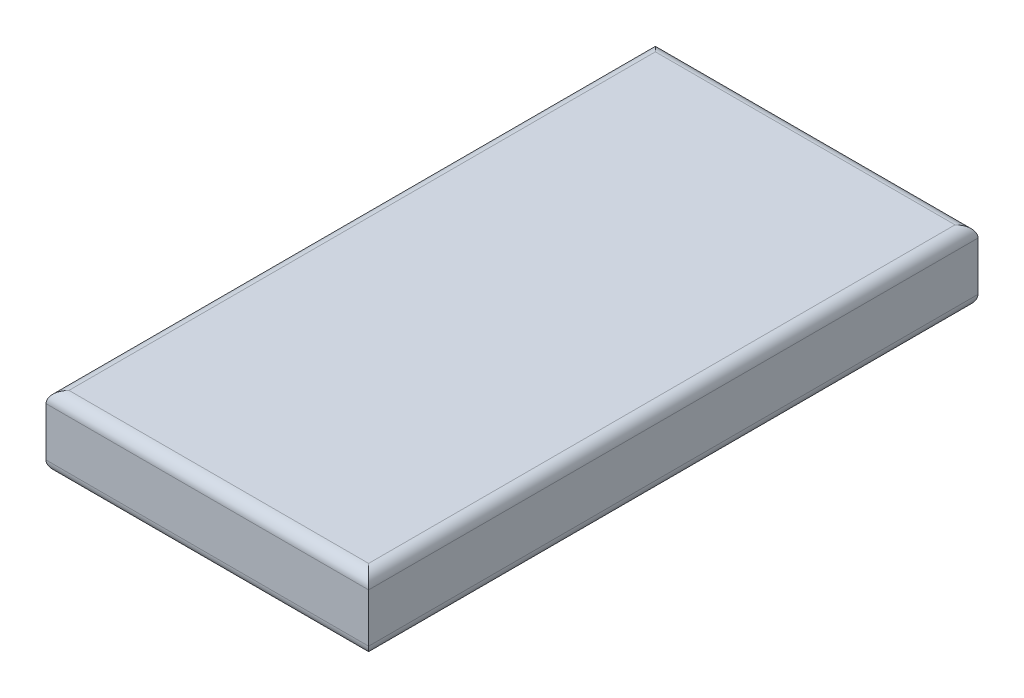
ISO-10303-21;
HEADER;
FILE_DESCRIPTION(('STEP AP214'),'2;1');
FILE_NAME('part.step','',(''),(''),'','','');
FILE_SCHEMA(('AUTOMOTIVE_DESIGN { 1 0 10303 214 1 1 1 1 }'));
ENDSEC;
DATA;
#1=APPLICATION_CONTEXT('core data for automotive mechanical design processes');
#2=APPLICATION_PROTOCOL_DEFINITION('international standard','automotive_design',2000,#1);
#3=PRODUCT_CONTEXT('',#1,'mechanical');
#4=PRODUCT('Part','Part','',(#3));
#5=PRODUCT_RELATED_PRODUCT_CATEGORY('part','',(#4));
#6=PRODUCT_DEFINITION_FORMATION('','',#4);
#7=PRODUCT_DEFINITION_CONTEXT('part definition',#1,'design');
#8=PRODUCT_DEFINITION('design','',#6,#7);
#9=PRODUCT_DEFINITION_SHAPE('','',#8);
#10=(LENGTH_UNIT() NAMED_UNIT(*) SI_UNIT(.MILLI.,.METRE.));
#11=(NAMED_UNIT(*) PLANE_ANGLE_UNIT() SI_UNIT($,.RADIAN.));
#12=(NAMED_UNIT(*) SI_UNIT($,.STERADIAN.) SOLID_ANGLE_UNIT());
#13=UNCERTAINTY_MEASURE_WITH_UNIT(LENGTH_MEASURE(1.E-05),#10,'distance_accuracy_value','');
#14=(GEOMETRIC_REPRESENTATION_CONTEXT(3) GLOBAL_UNCERTAINTY_ASSIGNED_CONTEXT((#13)) GLOBAL_UNIT_ASSIGNED_CONTEXT((#10,
#11,#12)) REPRESENTATION_CONTEXT('',''));
#15=CARTESIAN_POINT('',(0.,0.,0.));
#16=DIRECTION('',(0.,0.,1.));
#17=DIRECTION('',(1.,0.,0.));
#18=AXIS2_PLACEMENT_3D('',#15,#16,#17);
#19=CARTESIAN_POINT('',(0.,3.175,0.));
#20=DIRECTION('',(-1.,0.,0.));
#21=DIRECTION('',(0.,0.,1.));
#22=AXIS2_PLACEMENT_3D('',#19,#20,#21);
#23=PLANE('',#22);
#24=DIRECTION('',(0.,-1.,0.));
#25=VECTOR('',#24,1.);
#26=CARTESIAN_POINT('',(0.,3.175,0.));
#27=LINE('',#26,#25);
#28=CARTESIAN_POINT('',(0.,2.667,0.));
#29=VERTEX_POINT('',#28);
#30=CARTESIAN_POINT('',(0.,0.508,0.));
#31=VERTEX_POINT('',#30);
#32=EDGE_CURVE('E162',#29,#31,#27,.T.);
#33=ORIENTED_EDGE('',*,*,#32,.T.);
#34=DIRECTION('',(0.,0.,-1.));
#35=VECTOR('',#34,1.);
#36=CARTESIAN_POINT('',(0.,0.508,0.));
#37=LINE('',#36,#35);
#38=CARTESIAN_POINT('',(0.,0.508,-26.9875));
#39=VERTEX_POINT('',#38);
#40=EDGE_CURVE('E176',#31,#39,#37,.T.);
#41=ORIENTED_EDGE('',*,*,#40,.T.);
#42=DIRECTION('',(0.,-1.,0.));
#43=VECTOR('',#42,1.);
#44=CARTESIAN_POINT('',(0.,3.175,-26.9875));
#45=LINE('',#44,#43);
#46=CARTESIAN_POINT('',(0.,2.667,-26.9875));
#47=VERTEX_POINT('',#46);
#48=EDGE_CURVE('E133',#47,#39,#45,.T.);
#49=ORIENTED_EDGE('',*,*,#48,.F.);
#50=DIRECTION('',(0.,0.,-1.));
#51=VECTOR('',#50,1.);
#52=CARTESIAN_POINT('',(0.,2.667,0.));
#53=LINE('',#52,#51);
#54=EDGE_CURVE('E179',#47,#29,#53,.F.);
#55=ORIENTED_EDGE('',*,*,#54,.T.);
#56=EDGE_LOOP('',(#33,#41,#49,#55));
#57=FACE_BOUND('',#56,.T.);
#58=ADVANCED_FACE('F43',(#57),#23,.F.);
#59=CARTESIAN_POINT('',(0.,3.175,-26.9875));
#60=DIRECTION('',(0.,0.,1.));
#61=DIRECTION('',(1.,0.,0.));
#62=AXIS2_PLACEMENT_3D('',#59,#60,#61);
#63=PLANE('',#62);
#64=ORIENTED_EDGE('',*,*,#48,.T.);
#65=DIRECTION('',(-1.,0.,0.));
#66=VECTOR('',#65,1.);
#67=CARTESIAN_POINT('',(0.,0.508,-26.9875));
#68=LINE('',#67,#66);
#69=CARTESIAN_POINT('',(-14.2875,0.508,-26.9875));
#70=VERTEX_POINT('',#69);
#71=EDGE_CURVE('E131',#39,#70,#68,.T.);
#72=ORIENTED_EDGE('',*,*,#71,.T.);
#73=DIRECTION('',(0.,-1.,0.));
#74=VECTOR('',#73,1.);
#75=CARTESIAN_POINT('',(-14.2875,3.175,-26.9875));
#76=LINE('',#75,#74);
#77=CARTESIAN_POINT('',(-14.2875,2.667,-26.9875));
#78=VERTEX_POINT('',#77);
#79=EDGE_CURVE('E113',#78,#70,#76,.T.);
#80=ORIENTED_EDGE('',*,*,#79,.F.);
#81=DIRECTION('',(-1.,0.,0.));
#82=VECTOR('',#81,1.);
#83=CARTESIAN_POINT('',(0.,2.667,-26.9875));
#84=LINE('',#83,#82);
#85=EDGE_CURVE('E128',#78,#47,#84,.F.);
#86=ORIENTED_EDGE('',*,*,#85,.T.);
#87=EDGE_LOOP('',(#64,#72,#80,#86));
#88=FACE_BOUND('',#87,.T.);
#89=ADVANCED_FACE('F127',(#88),#63,.F.);
#90=CARTESIAN_POINT('',(-14.2875,3.175,0.));
#91=DIRECTION('',(1.,0.,0.));
#92=DIRECTION('',(0.,0.,-1.));
#93=AXIS2_PLACEMENT_3D('',#90,#91,#92);
#94=PLANE('',#93);
#95=ORIENTED_EDGE('',*,*,#79,.T.);
#96=DIRECTION('',(0.,0.,1.));
#97=VECTOR('',#96,1.);
#98=CARTESIAN_POINT('',(-14.2875,0.508,0.));
#99=LINE('',#98,#97);
#100=CARTESIAN_POINT('',(-14.2875,0.508,0.));
#101=VERTEX_POINT('',#100);
#102=EDGE_CURVE('E120',#70,#101,#99,.T.);
#103=ORIENTED_EDGE('',*,*,#102,.T.);
#104=DIRECTION('',(0.,-1.,0.));
#105=VECTOR('',#104,1.);
#106=CARTESIAN_POINT('',(-14.2875,3.175,0.));
#107=LINE('',#106,#105);
#108=CARTESIAN_POINT('',(-14.2875,2.667,0.));
#109=VERTEX_POINT('',#108);
#110=EDGE_CURVE('E115',#109,#101,#107,.T.);
#111=ORIENTED_EDGE('',*,*,#110,.F.);
#112=DIRECTION('',(0.,0.,1.));
#113=VECTOR('',#112,1.);
#114=CARTESIAN_POINT('',(-14.2875,2.667,-26.9875));
#115=LINE('',#114,#113);
#116=EDGE_CURVE('E110',#109,#78,#115,.F.);
#117=ORIENTED_EDGE('',*,*,#116,.T.);
#118=EDGE_LOOP('',(#95,#103,#111,#117));
#119=FACE_BOUND('',#118,.T.);
#120=ADVANCED_FACE('F112',(#119),#94,.F.);
#121=CARTESIAN_POINT('',(0.,3.175,0.));
#122=DIRECTION('',(0.,0.,-1.));
#123=DIRECTION('',(-1.,0.,0.));
#124=AXIS2_PLACEMENT_3D('',#121,#122,#123);
#125=PLANE('',#124);
#126=ORIENTED_EDGE('',*,*,#110,.T.);
#127=DIRECTION('',(1.,0.,0.));
#128=VECTOR('',#127,1.);
#129=CARTESIAN_POINT('',(0.,0.508,0.));
#130=LINE('',#129,#128);
#131=EDGE_CURVE('E182',#101,#31,#130,.T.);
#132=ORIENTED_EDGE('',*,*,#131,.T.);
#133=ORIENTED_EDGE('',*,*,#32,.F.);
#134=DIRECTION('',(1.,0.,0.));
#135=VECTOR('',#134,1.);
#136=CARTESIAN_POINT('',(-14.2875,2.667,0.));
#137=LINE('',#136,#135);
#138=EDGE_CURVE('E185',#29,#109,#137,.F.);
#139=ORIENTED_EDGE('',*,*,#138,.T.);
#140=EDGE_LOOP('',(#126,#132,#133,#139));
#141=FACE_BOUND('',#140,.T.);
#142=ADVANCED_FACE('F233',(#141),#125,.F.);
#143=CARTESIAN_POINT('',(0.,3.175,0.));
#144=DIRECTION('',(0.,1.,0.));
#145=DIRECTION('',(0.,0.,1.));
#146=AXIS2_PLACEMENT_3D('',#143,#144,#145);
#147=PLANE('',#146);
#148=DIRECTION('',(0.,0.,1.));
#149=VECTOR('',#148,1.);
#150=CARTESIAN_POINT('',(-13.7795,3.175,0.));
#151=LINE('',#150,#149);
#152=CARTESIAN_POINT('',(-13.7795,3.175,-26.4795));
#153=VERTEX_POINT('',#152);
#154=CARTESIAN_POINT('',(-13.7795,3.175,-0.508));
#155=VERTEX_POINT('',#154);
#156=EDGE_CURVE('E53',#153,#155,#151,.T.);
#157=ORIENTED_EDGE('',*,*,#156,.T.);
#158=DIRECTION('',(1.,0.,0.));
#159=VECTOR('',#158,1.);
#160=CARTESIAN_POINT('',(0.,3.175,-0.508));
#161=LINE('',#160,#159);
#162=CARTESIAN_POINT('',(-0.508,3.175,-0.508));
#163=VERTEX_POINT('',#162);
#164=EDGE_CURVE('E11',#155,#163,#161,.T.);
#165=ORIENTED_EDGE('',*,*,#164,.T.);
#166=DIRECTION('',(0.,0.,-1.));
#167=VECTOR('',#166,1.);
#168=CARTESIAN_POINT('',(-0.508,3.175,-26.9875));
#169=LINE('',#168,#167);
#170=CARTESIAN_POINT('',(-0.508,3.175,-26.4795));
#171=VERTEX_POINT('',#170);
#172=EDGE_CURVE('E173',#163,#171,#169,.T.);
#173=ORIENTED_EDGE('',*,*,#172,.T.);
#174=DIRECTION('',(-1.,0.,0.));
#175=VECTOR('',#174,1.);
#176=CARTESIAN_POINT('',(-14.2875,3.175,-26.4795));
#177=LINE('',#176,#175);
#178=EDGE_CURVE('E64',#171,#153,#177,.T.);
#179=ORIENTED_EDGE('',*,*,#178,.T.);
#180=EDGE_LOOP('',(#157,#165,#173,#179));
#181=FACE_BOUND('',#180,.T.);
#182=ADVANCED_FACE('F239',(#181),#147,.T.);
#183=CARTESIAN_POINT('',(0.,0.,0.));
#184=DIRECTION('',(0.,1.,0.));
#185=DIRECTION('',(0.,0.,1.));
#186=AXIS2_PLACEMENT_3D('',#183,#184,#185);
#187=PLANE('',#186);
#188=DIRECTION('',(0.,0.,1.));
#189=VECTOR('',#188,1.);
#190=CARTESIAN_POINT('',(-13.7795,0.,0.));
#191=LINE('',#190,#189);
#192=CARTESIAN_POINT('',(-13.7795,0.,-0.508));
#193=VERTEX_POINT('',#192);
#194=CARTESIAN_POINT('',(-13.7795,0.,-26.4795));
#195=VERTEX_POINT('',#194);
#196=EDGE_CURVE('E193',#193,#195,#191,.F.);
#197=ORIENTED_EDGE('',*,*,#196,.T.);
#198=DIRECTION('',(-1.,0.,0.));
#199=VECTOR('',#198,1.);
#200=CARTESIAN_POINT('',(0.,0.,-26.4795));
#201=LINE('',#200,#199);
#202=CARTESIAN_POINT('',(-0.508,0.,-26.4795));
#203=VERTEX_POINT('',#202);
#204=EDGE_CURVE('E121',#195,#203,#201,.F.);
#205=ORIENTED_EDGE('',*,*,#204,.T.);
#206=DIRECTION('',(0.,0.,-1.));
#207=VECTOR('',#206,1.);
#208=CARTESIAN_POINT('',(-0.508,0.,0.));
#209=LINE('',#208,#207);
#210=CARTESIAN_POINT('',(-0.508,0.,-0.508));
#211=VERTEX_POINT('',#210);
#212=EDGE_CURVE('E199',#203,#211,#209,.F.);
#213=ORIENTED_EDGE('',*,*,#212,.T.);
#214=DIRECTION('',(1.,0.,0.));
#215=VECTOR('',#214,1.);
#216=CARTESIAN_POINT('',(0.,0.,-0.508));
#217=LINE('',#216,#215);
#218=EDGE_CURVE('E196',#211,#193,#217,.F.);
#219=ORIENTED_EDGE('',*,*,#218,.T.);
#220=EDGE_LOOP('',(#197,#205,#213,#219));
#221=FACE_BOUND('',#220,.T.);
#222=ADVANCED_FACE('F241',(#221),#187,.F.);
#223=CARTESIAN_POINT('',(0.,0.508,-0.508));
#224=DIRECTION('',(1.,0.,0.));
#225=DIRECTION('',(0.,0.,-1.));
#226=AXIS2_PLACEMENT_3D('',#223,#224,#225);
#227=CYLINDRICAL_SURFACE('',#226,0.508);
#228=CARTESIAN_POINT('',(-13.7795,0.508,-0.508));
#229=DIRECTION('',(0.707106781186547,0.,0.707106781186547));
#230=DIRECTION('',(0.707106781186547,0.,-0.707106781186547));
#231=AXIS2_PLACEMENT_3D('',#228,#229,#230);
#232=ELLIPSE('',#231,0.718420489685532,0.508);
#233=EDGE_CURVE('E163',#193,#101,#232,.F.);
#234=ORIENTED_EDGE('',*,*,#233,.F.);
#235=ORIENTED_EDGE('',*,*,#218,.F.);
#236=CARTESIAN_POINT('',(-0.508,0.508,-0.508));
#237=DIRECTION('',(0.707106781186547,0.,-0.707106781186547));
#238=DIRECTION('',(-0.707106781186547,0.,-0.707106781186547));
#239=AXIS2_PLACEMENT_3D('',#236,#237,#238);
#240=ELLIPSE('',#239,0.718420489685532,0.508);
#241=EDGE_CURVE('E158',#31,#211,#240,.T.);
#242=ORIENTED_EDGE('',*,*,#241,.F.);
#243=ORIENTED_EDGE('',*,*,#131,.F.);
#244=EDGE_LOOP('',(#234,#235,#242,#243));
#245=FACE_BOUND('',#244,.T.);
#246=ADVANCED_FACE('F220',(#245),#227,.T.);
#247=CARTESIAN_POINT('',(-0.508,0.508,0.));
#248=DIRECTION('',(0.,0.,-1.));
#249=DIRECTION('',(-1.,0.,0.));
#250=AXIS2_PLACEMENT_3D('',#247,#248,#249);
#251=CYLINDRICAL_SURFACE('',#250,0.508);
#252=ORIENTED_EDGE('',*,*,#241,.T.);
#253=ORIENTED_EDGE('',*,*,#212,.F.);
#254=CARTESIAN_POINT('',(-0.508,0.508,-26.4795));
#255=DIRECTION('',(-0.707106781186548,0.,-0.707106781186547));
#256=DIRECTION('',(0.707106781186547,0.,-0.707106781186548));
#257=AXIS2_PLACEMENT_3D('',#254,#255,#256);
#258=ELLIPSE('',#257,0.718420489685532,0.508);
#259=EDGE_CURVE('E147',#39,#203,#258,.T.);
#260=ORIENTED_EDGE('',*,*,#259,.F.);
#261=ORIENTED_EDGE('',*,*,#40,.F.);
#262=EDGE_LOOP('',(#252,#253,#260,#261));
#263=FACE_BOUND('',#262,.T.);
#264=ADVANCED_FACE('F224',(#263),#251,.T.);
#265=CARTESIAN_POINT('',(-13.7795,0.508,0.));
#266=DIRECTION('',(0.,0.,1.));
#267=DIRECTION('',(1.,0.,0.));
#268=AXIS2_PLACEMENT_3D('',#265,#266,#267);
#269=CYLINDRICAL_SURFACE('',#268,0.508);
#270=ORIENTED_EDGE('',*,*,#233,.T.);
#271=ORIENTED_EDGE('',*,*,#102,.F.);
#272=CARTESIAN_POINT('',(-13.7795,0.508,-26.4795));
#273=DIRECTION('',(-0.707106781186547,0.,0.707106781186548));
#274=DIRECTION('',(0.707106781186548,0.,0.707106781186547));
#275=AXIS2_PLACEMENT_3D('',#272,#273,#274);
#276=ELLIPSE('',#275,0.718420489685532,0.508);
#277=EDGE_CURVE('E144',#195,#70,#276,.F.);
#278=ORIENTED_EDGE('',*,*,#277,.F.);
#279=ORIENTED_EDGE('',*,*,#196,.F.);
#280=EDGE_LOOP('',(#270,#271,#278,#279));
#281=FACE_BOUND('',#280,.T.);
#282=ADVANCED_FACE('F232',(#281),#269,.T.);
#283=CARTESIAN_POINT('',(0.,0.508,-26.4795));
#284=DIRECTION('',(-1.,0.,0.));
#285=DIRECTION('',(0.,0.,1.));
#286=AXIS2_PLACEMENT_3D('',#283,#284,#285);
#287=CYLINDRICAL_SURFACE('',#286,0.508);
#288=ORIENTED_EDGE('',*,*,#259,.T.);
#289=ORIENTED_EDGE('',*,*,#204,.F.);
#290=ORIENTED_EDGE('',*,*,#277,.T.);
#291=ORIENTED_EDGE('',*,*,#71,.F.);
#292=EDGE_LOOP('',(#288,#289,#290,#291));
#293=FACE_BOUND('',#292,.T.);
#294=ADVANCED_FACE('F227',(#293),#287,.T.);
#295=CARTESIAN_POINT('',(0.,2.667,-26.4795));
#296=DIRECTION('',(1.,0.,0.));
#297=DIRECTION('',(0.,0.,-1.));
#298=AXIS2_PLACEMENT_3D('',#295,#296,#297);
#299=CYLINDRICAL_SURFACE('',#298,0.508);
#300=CARTESIAN_POINT('',(-0.508,2.667,-26.4795));
#301=DIRECTION('',(0.707106781186548,0.,0.707106781186547));
#302=DIRECTION('',(-0.707106781186547,0.,0.707106781186548));
#303=AXIS2_PLACEMENT_3D('',#300,#301,#302);
#304=ELLIPSE('',#303,0.718420489685532,0.508);
#305=EDGE_CURVE('E138',#47,#171,#304,.T.);
#306=ORIENTED_EDGE('',*,*,#305,.F.);
#307=ORIENTED_EDGE('',*,*,#85,.F.);
#308=CARTESIAN_POINT('',(-13.7795,2.667,-26.4795));
#309=DIRECTION('',(0.707106781186547,0.,-0.707106781186548));
#310=DIRECTION('',(0.707106781186548,0.,0.707106781186547));
#311=AXIS2_PLACEMENT_3D('',#308,#309,#310);
#312=ELLIPSE('',#311,0.718420489685532,0.508);
#313=EDGE_CURVE('E47',#153,#78,#312,.F.);
#314=ORIENTED_EDGE('',*,*,#313,.F.);
#315=ORIENTED_EDGE('',*,*,#178,.F.);
#316=EDGE_LOOP('',(#306,#307,#314,#315));
#317=FACE_BOUND('',#316,.T.);
#318=ADVANCED_FACE('F45',(#317),#299,.T.);
#319=CARTESIAN_POINT('',(-13.7795,2.667,0.));
#320=DIRECTION('',(0.,0.,-1.));
#321=DIRECTION('',(-1.,0.,0.));
#322=AXIS2_PLACEMENT_3D('',#319,#320,#321);
#323=CYLINDRICAL_SURFACE('',#322,0.508);
#324=ORIENTED_EDGE('',*,*,#313,.T.);
#325=ORIENTED_EDGE('',*,*,#116,.F.);
#326=CARTESIAN_POINT('',(-13.7795,2.667,-0.508));
#327=DIRECTION('',(-0.707106781186547,0.,-0.707106781186547));
#328=DIRECTION('',(0.707106781186547,0.,-0.707106781186547));
#329=AXIS2_PLACEMENT_3D('',#326,#327,#328);
#330=ELLIPSE('',#329,0.718420489685532,0.508);
#331=EDGE_CURVE('E149',#155,#109,#330,.F.);
#332=ORIENTED_EDGE('',*,*,#331,.F.);
#333=ORIENTED_EDGE('',*,*,#156,.F.);
#334=EDGE_LOOP('',(#324,#325,#332,#333));
#335=FACE_BOUND('',#334,.T.);
#336=ADVANCED_FACE('F142',(#335),#323,.T.);
#337=CARTESIAN_POINT('',(-0.508,2.667,0.));
#338=DIRECTION('',(0.,0.,1.));
#339=DIRECTION('',(1.,0.,0.));
#340=AXIS2_PLACEMENT_3D('',#337,#338,#339);
#341=CYLINDRICAL_SURFACE('',#340,0.508);
#342=ORIENTED_EDGE('',*,*,#305,.T.);
#343=ORIENTED_EDGE('',*,*,#172,.F.);
#344=CARTESIAN_POINT('',(-0.508,2.667,-0.508));
#345=DIRECTION('',(-0.707106781186547,0.,0.707106781186547));
#346=DIRECTION('',(0.707106781186547,0.,0.707106781186547));
#347=AXIS2_PLACEMENT_3D('',#344,#345,#346);
#348=ELLIPSE('',#347,0.718420489685532,0.508);
#349=EDGE_CURVE('E153',#29,#163,#348,.T.);
#350=ORIENTED_EDGE('',*,*,#349,.F.);
#351=ORIENTED_EDGE('',*,*,#54,.F.);
#352=EDGE_LOOP('',(#342,#343,#350,#351));
#353=FACE_BOUND('',#352,.T.);
#354=ADVANCED_FACE('F238',(#353),#341,.T.);
#355=CARTESIAN_POINT('',(0.,2.667,-0.508));
#356=DIRECTION('',(-1.,0.,0.));
#357=DIRECTION('',(0.,0.,1.));
#358=AXIS2_PLACEMENT_3D('',#355,#356,#357);
#359=CYLINDRICAL_SURFACE('',#358,0.508);
#360=ORIENTED_EDGE('',*,*,#331,.T.);
#361=ORIENTED_EDGE('',*,*,#138,.F.);
#362=ORIENTED_EDGE('',*,*,#349,.T.);
#363=ORIENTED_EDGE('',*,*,#164,.F.);
#364=EDGE_LOOP('',(#360,#361,#362,#363));
#365=FACE_BOUND('',#364,.T.);
#366=ADVANCED_FACE('F236',(#365),#359,.T.);
#367=CLOSED_SHELL('',(#58,#89,#120,#142,#182,#222,#246,#264,#282,#294,#318,#336,#354,#366));
#368=MANIFOLD_SOLID_BREP('B2',#367);
#369=ADVANCED_BREP_SHAPE_REPRESENTATION('',(#18,#368),#14);
#370=SHAPE_DEFINITION_REPRESENTATION(#9,#369);
ENDSEC;
END-ISO-10303-21;
